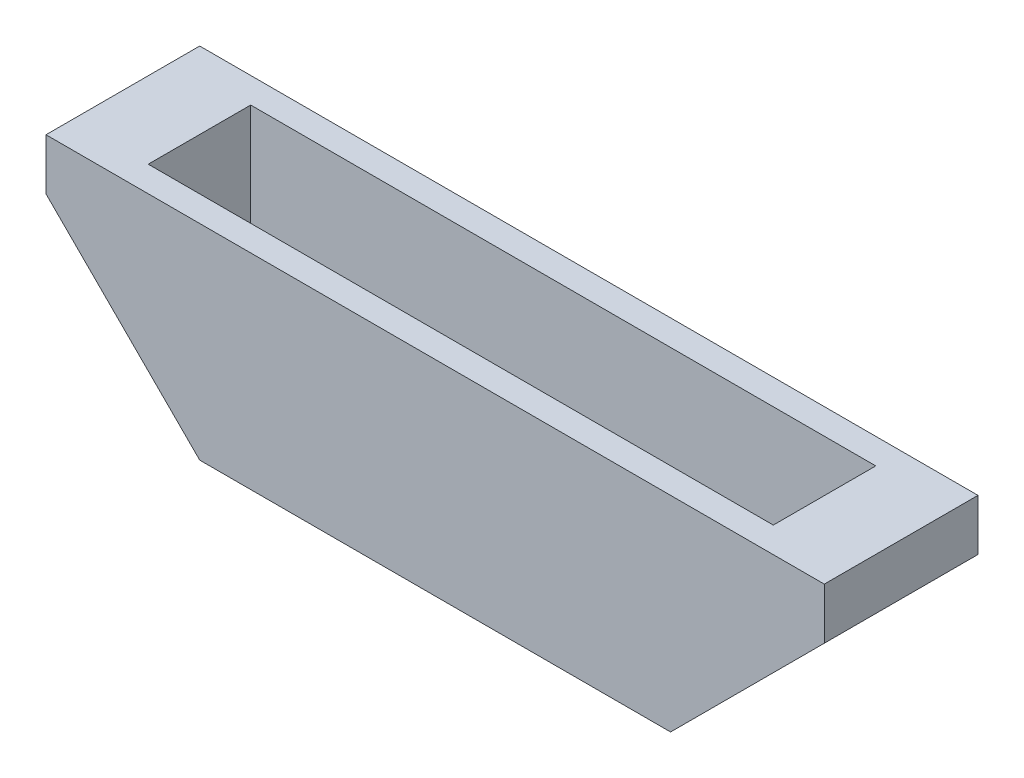
ISO-10303-21;
HEADER;
FILE_DESCRIPTION(('STEP AP214'),'2;1');
FILE_NAME('part.step','',(''),(''),'','','');
FILE_SCHEMA(('AUTOMOTIVE_DESIGN { 1 0 10303 214 1 1 1 1 }'));
ENDSEC;
DATA;
#1=APPLICATION_CONTEXT('core data for automotive mechanical design processes');
#2=APPLICATION_PROTOCOL_DEFINITION('international standard','automotive_design',2000,#1);
#3=PRODUCT_CONTEXT('',#1,'mechanical');
#4=PRODUCT('Part','Part','',(#3));
#5=PRODUCT_RELATED_PRODUCT_CATEGORY('part','',(#4));
#6=PRODUCT_DEFINITION_FORMATION('','',#4);
#7=PRODUCT_DEFINITION_CONTEXT('part definition',#1,'design');
#8=PRODUCT_DEFINITION('design','',#6,#7);
#9=PRODUCT_DEFINITION_SHAPE('','',#8);
#10=(LENGTH_UNIT() NAMED_UNIT(*) SI_UNIT(.MILLI.,.METRE.));
#11=(NAMED_UNIT(*) PLANE_ANGLE_UNIT() SI_UNIT($,.RADIAN.));
#12=(NAMED_UNIT(*) SI_UNIT($,.STERADIAN.) SOLID_ANGLE_UNIT());
#13=UNCERTAINTY_MEASURE_WITH_UNIT(LENGTH_MEASURE(1.E-05),#10,'distance_accuracy_value','');
#14=(GEOMETRIC_REPRESENTATION_CONTEXT(3) GLOBAL_UNCERTAINTY_ASSIGNED_CONTEXT((#13)) GLOBAL_UNIT_ASSIGNED_CONTEXT((#10,
#11,#12)) REPRESENTATION_CONTEXT('',''));
#15=CARTESIAN_POINT('',(0.,0.,0.));
#16=DIRECTION('',(0.,0.,1.));
#17=DIRECTION('',(1.,0.,0.));
#18=AXIS2_PLACEMENT_3D('',#15,#16,#17);
#19=CARTESIAN_POINT('',(0.,0.,0.));
#20=DIRECTION('',(0.,1.,0.));
#21=DIRECTION('',(0.,0.,1.));
#22=AXIS2_PLACEMENT_3D('',#19,#20,#21);
#23=PLANE('',#22);
#24=DIRECTION('',(1.,0.,0.));
#25=VECTOR('',#24,1.);
#26=CARTESIAN_POINT('',(0.,0.,12.7));
#27=LINE('',#26,#25);
#28=CARTESIAN_POINT('',(-77.47,0.,12.7));
#29=VERTEX_POINT('',#28);
#30=CARTESIAN_POINT('',(77.47,0.,12.7));
#31=VERTEX_POINT('',#30);
#32=EDGE_CURVE('E84',#29,#31,#27,.T.);
#33=ORIENTED_EDGE('',*,*,#32,.F.);
#34=DIRECTION('',(0.,0.,-1.));
#35=VECTOR('',#34,1.);
#36=CARTESIAN_POINT('',(-77.47,0.,0.));
#37=LINE('',#36,#35);
#38=CARTESIAN_POINT('',(-77.47,0.,-12.7));
#39=VERTEX_POINT('',#38);
#40=EDGE_CURVE('E182',#29,#39,#37,.T.);
#41=ORIENTED_EDGE('',*,*,#40,.T.);
#42=DIRECTION('',(1.,0.,0.));
#43=VECTOR('',#42,1.);
#44=CARTESIAN_POINT('',(0.,0.,-12.7));
#45=LINE('',#44,#43);
#46=CARTESIAN_POINT('',(77.47,0.,-12.7));
#47=VERTEX_POINT('',#46);
#48=EDGE_CURVE('E163',#39,#47,#45,.T.);
#49=ORIENTED_EDGE('',*,*,#48,.T.);
#50=DIRECTION('',(0.,0.,-1.));
#51=VECTOR('',#50,1.);
#52=CARTESIAN_POINT('',(77.47,0.,0.));
#53=LINE('',#52,#51);
#54=EDGE_CURVE('E175',#31,#47,#53,.T.);
#55=ORIENTED_EDGE('',*,*,#54,.F.);
#56=EDGE_LOOP('',(#33,#41,#49,#55));
#57=FACE_BOUND('',#56,.T.);
#58=DIRECTION('',(1.,0.,0.));
#59=VECTOR('',#58,1.);
#60=CARTESIAN_POINT('',(0.,0.,19.05));
#61=LINE('',#60,#59);
#62=CARTESIAN_POINT('',(-96.460563282851,0.,19.05));
#63=VERTEX_POINT('',#62);
#64=CARTESIAN_POINT('',(96.4605632828511,0.,19.05));
#65=VERTEX_POINT('',#64);
#66=EDGE_CURVE('E206',#63,#65,#61,.T.);
#67=ORIENTED_EDGE('',*,*,#66,.T.);
#68=DIRECTION('',(0.,0.,-1.));
#69=VECTOR('',#68,1.);
#70=CARTESIAN_POINT('',(96.4605632828511,0.,0.));
#71=LINE('',#70,#69);
#72=CARTESIAN_POINT('',(96.4605632828511,0.,-19.05));
#73=VERTEX_POINT('',#72);
#74=EDGE_CURVE('E220',#65,#73,#71,.T.);
#75=ORIENTED_EDGE('',*,*,#74,.T.);
#76=DIRECTION('',(1.,0.,0.));
#77=VECTOR('',#76,1.);
#78=CARTESIAN_POINT('',(0.,0.,-19.05));
#79=LINE('',#78,#77);
#80=CARTESIAN_POINT('',(-96.460563282851,0.,-19.05));
#81=VERTEX_POINT('',#80);
#82=EDGE_CURVE('E224',#81,#73,#79,.T.);
#83=ORIENTED_EDGE('',*,*,#82,.F.);
#84=DIRECTION('',(0.,0.,-1.));
#85=VECTOR('',#84,1.);
#86=CARTESIAN_POINT('',(-96.460563282851,0.,0.));
#87=LINE('',#86,#85);
#88=EDGE_CURVE('E212',#63,#81,#87,.T.);
#89=ORIENTED_EDGE('',*,*,#88,.F.);
#90=EDGE_LOOP('',(#67,#75,#83,#89));
#91=FACE_BOUND('',#90,.T.);
#92=ADVANCED_FACE('F67',(#57,#91),#23,.T.);
#93=CARTESIAN_POINT('',(-96.460563282851,-50.8,0.));
#94=DIRECTION('',(1.,0.,0.));
#95=DIRECTION('',(0.,0.,-1.));
#96=AXIS2_PLACEMENT_3D('',#93,#94,#95);
#97=PLANE('',#96);
#98=DIRECTION('',(0.,1.,0.));
#99=VECTOR('',#98,1.);
#100=CARTESIAN_POINT('',(-96.460563282851,-50.8,-19.05));
#101=LINE('',#100,#99);
#102=CARTESIAN_POINT('',(-96.460563282851,-12.6999999999998,-19.05));
#103=VERTEX_POINT('',#102);
#104=EDGE_CURVE('E235',#103,#81,#101,.T.);
#105=ORIENTED_EDGE('',*,*,#104,.F.);
#106=DIRECTION('',(0.,0.,1.));
#107=VECTOR('',#106,1.);
#108=CARTESIAN_POINT('',(-96.460563282851,-12.6999999999998,0.));
#109=LINE('',#108,#107);
#110=CARTESIAN_POINT('',(-96.460563282851,-12.6999999999998,19.05));
#111=VERTEX_POINT('',#110);
#112=EDGE_CURVE('E265',#103,#111,#109,.T.);
#113=ORIENTED_EDGE('',*,*,#112,.T.);
#114=DIRECTION('',(0.,1.,0.));
#115=VECTOR('',#114,1.);
#116=CARTESIAN_POINT('',(-96.460563282851,-50.8,19.05));
#117=LINE('',#116,#115);
#118=EDGE_CURVE('E231',#111,#63,#117,.T.);
#119=ORIENTED_EDGE('',*,*,#118,.T.);
#120=ORIENTED_EDGE('',*,*,#88,.T.);
#121=EDGE_LOOP('',(#105,#113,#119,#120));
#122=FACE_BOUND('',#121,.T.);
#123=ADVANCED_FACE('F302',(#122),#97,.F.);
#124=CARTESIAN_POINT('',(0.,-50.8,19.05));
#125=DIRECTION('',(0.,0.,1.));
#126=DIRECTION('',(1.,0.,0.));
#127=AXIS2_PLACEMENT_3D('',#124,#125,#126);
#128=PLANE('',#127);
#129=DIRECTION('',(1.,0.,0.));
#130=VECTOR('',#129,1.);
#131=CARTESIAN_POINT('',(0.,-50.8,19.05));
#132=LINE('',#131,#130);
#133=CARTESIAN_POINT('',(-58.360563282851,-50.8,19.05));
#134=VERTEX_POINT('',#133);
#135=CARTESIAN_POINT('',(58.3605632828509,-50.8,19.05));
#136=VERTEX_POINT('',#135);
#137=EDGE_CURVE('E207',#134,#136,#132,.T.);
#138=ORIENTED_EDGE('',*,*,#137,.T.);
#139=DIRECTION('',(0.707106781186549,0.707106781186547,0.));
#140=VECTOR('',#139,1.);
#141=CARTESIAN_POINT('',(29.1802816414254,-79.9802816414255,19.05));
#142=LINE('',#141,#140);
#143=CARTESIAN_POINT('',(96.4605632828511,-12.7,19.05));
#144=VERTEX_POINT('',#143);
#145=EDGE_CURVE('E262',#136,#144,#142,.T.);
#146=ORIENTED_EDGE('',*,*,#145,.T.);
#147=DIRECTION('',(0.,1.,0.));
#148=VECTOR('',#147,1.);
#149=CARTESIAN_POINT('',(96.4605632828511,-50.8,19.05));
#150=LINE('',#149,#148);
#151=EDGE_CURVE('E216',#144,#65,#150,.T.);
#152=ORIENTED_EDGE('',*,*,#151,.T.);
#153=ORIENTED_EDGE('',*,*,#66,.F.);
#154=ORIENTED_EDGE('',*,*,#118,.F.);
#155=DIRECTION('',(-0.707106781186546,0.707106781186549,0.));
#156=VECTOR('',#155,1.);
#157=CARTESIAN_POINT('',(-29.1802816414256,-79.9802816414255,19.05));
#158=LINE('',#157,#156);
#159=EDGE_CURVE('E259',#111,#134,#158,.F.);
#160=ORIENTED_EDGE('',*,*,#159,.T.);
#161=EDGE_LOOP('',(#138,#146,#152,#153,#154,#160));
#162=FACE_BOUND('',#161,.T.);
#163=ADVANCED_FACE('F304',(#162),#128,.T.);
#164=CARTESIAN_POINT('',(96.4605632828511,-50.8,0.));
#165=DIRECTION('',(1.,0.,0.));
#166=DIRECTION('',(0.,0.,-1.));
#167=AXIS2_PLACEMENT_3D('',#164,#165,#166);
#168=PLANE('',#167);
#169=ORIENTED_EDGE('',*,*,#151,.F.);
#170=DIRECTION('',(0.,0.,-1.));
#171=VECTOR('',#170,1.);
#172=CARTESIAN_POINT('',(96.4605632828511,-12.7,-19.05));
#173=LINE('',#172,#171);
#174=CARTESIAN_POINT('',(96.4605632828511,-12.7,-19.05));
#175=VERTEX_POINT('',#174);
#176=EDGE_CURVE('E234',#144,#175,#173,.T.);
#177=ORIENTED_EDGE('',*,*,#176,.T.);
#178=DIRECTION('',(0.,1.,0.));
#179=VECTOR('',#178,1.);
#180=CARTESIAN_POINT('',(96.4605632828511,-50.8,-19.05));
#181=LINE('',#180,#179);
#182=EDGE_CURVE('E238',#175,#73,#181,.T.);
#183=ORIENTED_EDGE('',*,*,#182,.T.);
#184=ORIENTED_EDGE('',*,*,#74,.F.);
#185=EDGE_LOOP('',(#169,#177,#183,#184));
#186=FACE_BOUND('',#185,.T.);
#187=ADVANCED_FACE('F311',(#186),#168,.T.);
#188=CARTESIAN_POINT('',(0.,-50.8,-19.05));
#189=DIRECTION('',(0.,0.,1.));
#190=DIRECTION('',(1.,0.,0.));
#191=AXIS2_PLACEMENT_3D('',#188,#189,#190);
#192=PLANE('',#191);
#193=ORIENTED_EDGE('',*,*,#182,.F.);
#194=DIRECTION('',(-0.707106781186549,-0.707106781186547,0.));
#195=VECTOR('',#194,1.);
#196=CARTESIAN_POINT('',(96.4605632828511,-12.7,-19.05));
#197=LINE('',#196,#195);
#198=CARTESIAN_POINT('',(58.3605632828509,-50.8,-19.05));
#199=VERTEX_POINT('',#198);
#200=EDGE_CURVE('E249',#175,#199,#197,.T.);
#201=ORIENTED_EDGE('',*,*,#200,.T.);
#202=DIRECTION('',(1.,0.,0.));
#203=VECTOR('',#202,1.);
#204=CARTESIAN_POINT('',(0.,-50.8,-19.05));
#205=LINE('',#204,#203);
#206=CARTESIAN_POINT('',(-58.360563282851,-50.8,-19.05));
#207=VERTEX_POINT('',#206);
#208=EDGE_CURVE('E211',#207,#199,#205,.T.);
#209=ORIENTED_EDGE('',*,*,#208,.F.);
#210=DIRECTION('',(0.707106781186546,-0.707106781186549,0.));
#211=VECTOR('',#210,1.);
#212=CARTESIAN_POINT('',(-58.360563282851,-50.8,-19.05));
#213=LINE('',#212,#211);
#214=EDGE_CURVE('E246',#207,#103,#213,.F.);
#215=ORIENTED_EDGE('',*,*,#214,.T.);
#216=ORIENTED_EDGE('',*,*,#104,.T.);
#217=ORIENTED_EDGE('',*,*,#82,.T.);
#218=EDGE_LOOP('',(#193,#201,#209,#215,#216,#217));
#219=FACE_BOUND('',#218,.T.);
#220=ADVANCED_FACE('F318',(#219),#192,.F.);
#221=CARTESIAN_POINT('',(0.,-50.8,0.));
#222=DIRECTION('',(0.,1.,0.));
#223=DIRECTION('',(0.,0.,1.));
#224=AXIS2_PLACEMENT_3D('',#221,#222,#223);
#225=PLANE('',#224);
#226=ORIENTED_EDGE('',*,*,#208,.T.);
#227=DIRECTION('',(0.,0.,1.));
#228=VECTOR('',#227,1.);
#229=CARTESIAN_POINT('',(58.3605632828509,-50.8,19.05));
#230=LINE('',#229,#228);
#231=EDGE_CURVE('E256',#199,#136,#230,.T.);
#232=ORIENTED_EDGE('',*,*,#231,.T.);
#233=ORIENTED_EDGE('',*,*,#137,.F.);
#234=DIRECTION('',(0.,0.,-1.));
#235=VECTOR('',#234,1.);
#236=CARTESIAN_POINT('',(-58.360563282851,-50.8,0.));
#237=LINE('',#236,#235);
#238=EDGE_CURVE('E252',#134,#207,#237,.T.);
#239=ORIENTED_EDGE('',*,*,#238,.T.);
#240=EDGE_LOOP('',(#226,#232,#233,#239));
#241=FACE_BOUND('',#240,.T.);
#242=ADVANCED_FACE('F321',(#241),#225,.F.);
#243=CARTESIAN_POINT('',(96.4605632828511,-12.7,0.));
#244=DIRECTION('',(0.707106781186547,-0.707106781186549,0.));
#245=DIRECTION('',(0.,0.,1.));
#246=AXIS2_PLACEMENT_3D('',#243,#244,#245);
#247=PLANE('',#246);
#248=DIRECTION('',(0.,0.,1.));
#249=VECTOR('',#248,1.);
#250=CARTESIAN_POINT('',(77.47,-31.690563282851,0.));
#251=LINE('',#250,#249);
#252=CARTESIAN_POINT('',(77.47,-31.690563282851,-12.7));
#253=VERTEX_POINT('',#252);
#254=CARTESIAN_POINT('',(77.47,-31.690563282851,12.7));
#255=VERTEX_POINT('',#254);
#256=EDGE_CURVE('E12',#253,#255,#251,.T.);
#257=ORIENTED_EDGE('',*,*,#256,.F.);
#258=DIRECTION('',(-0.707106781186549,-0.707106781186547,0.));
#259=VECTOR('',#258,1.);
#260=CARTESIAN_POINT('',(96.4605632828511,-12.7,-12.7));
#261=LINE('',#260,#259);
#262=CARTESIAN_POINT('',(73.600563282851,-35.56,-12.7));
#263=VERTEX_POINT('',#262);
#264=EDGE_CURVE('E167',#253,#263,#261,.T.);
#265=ORIENTED_EDGE('',*,*,#264,.T.);
#266=DIRECTION('',(0.,0.,1.));
#267=VECTOR('',#266,1.);
#268=CARTESIAN_POINT('',(73.600563282851,-35.56,0.));
#269=LINE('',#268,#267);
#270=CARTESIAN_POINT('',(73.600563282851,-35.56,12.7));
#271=VERTEX_POINT('',#270);
#272=EDGE_CURVE('E192',#263,#271,#269,.T.);
#273=ORIENTED_EDGE('',*,*,#272,.T.);
#274=DIRECTION('',(-0.707106781186549,-0.707106781186547,0.));
#275=VECTOR('',#274,1.);
#276=CARTESIAN_POINT('',(96.4605632828511,-12.7,12.7));
#277=LINE('',#276,#275);
#278=EDGE_CURVE('E203',#255,#271,#277,.T.);
#279=ORIENTED_EDGE('',*,*,#278,.F.);
#280=EDGE_LOOP('',(#257,#265,#273,#279));
#281=FACE_BOUND('',#280,.T.);
#282=ORIENTED_EDGE('',*,*,#145,.F.);
#283=ORIENTED_EDGE('',*,*,#231,.F.);
#284=ORIENTED_EDGE('',*,*,#200,.F.);
#285=ORIENTED_EDGE('',*,*,#176,.F.);
#286=EDGE_LOOP('',(#282,#283,#284,#285));
#287=FACE_BOUND('',#286,.T.);
#288=ADVANCED_FACE('F291',(#281,#287),#247,.T.);
#289=CARTESIAN_POINT('',(-58.360563282851,-50.8,0.));
#290=DIRECTION('',(0.707106781186549,0.707106781186546,0.));
#291=DIRECTION('',(0.,0.,-1.));
#292=AXIS2_PLACEMENT_3D('',#289,#290,#291);
#293=PLANE('',#292);
#294=DIRECTION('',(0.707106781186546,-0.707106781186549,0.));
#295=VECTOR('',#294,1.);
#296=CARTESIAN_POINT('',(-58.360563282851,-50.8,12.7));
#297=LINE('',#296,#295);
#298=CARTESIAN_POINT('',(-73.6005632828509,-35.56,12.7));
#299=VERTEX_POINT('',#298);
#300=CARTESIAN_POINT('',(-77.47,-31.6905632828509,12.7));
#301=VERTEX_POINT('',#300);
#302=EDGE_CURVE('E77',#299,#301,#297,.F.);
#303=ORIENTED_EDGE('',*,*,#302,.F.);
#304=DIRECTION('',(0.,0.,1.));
#305=VECTOR('',#304,1.);
#306=CARTESIAN_POINT('',(-73.6005632828509,-35.56,0.));
#307=LINE('',#306,#305);
#308=CARTESIAN_POINT('',(-73.6005632828509,-35.56,-12.7));
#309=VERTEX_POINT('',#308);
#310=EDGE_CURVE('E268',#299,#309,#307,.F.);
#311=ORIENTED_EDGE('',*,*,#310,.T.);
#312=DIRECTION('',(0.707106781186546,-0.707106781186549,0.));
#313=VECTOR('',#312,1.);
#314=CARTESIAN_POINT('',(-58.360563282851,-50.8,-12.7));
#315=LINE('',#314,#313);
#316=CARTESIAN_POINT('',(-77.47,-31.6905632828509,-12.7));
#317=VERTEX_POINT('',#316);
#318=EDGE_CURVE('E272',#309,#317,#315,.F.);
#319=ORIENTED_EDGE('',*,*,#318,.T.);
#320=DIRECTION('',(0.,0.,-1.));
#321=VECTOR('',#320,1.);
#322=CARTESIAN_POINT('',(-77.47,-31.6905632828509,0.));
#323=LINE('',#322,#321);
#324=EDGE_CURVE('E276',#317,#301,#323,.F.);
#325=ORIENTED_EDGE('',*,*,#324,.T.);
#326=EDGE_LOOP('',(#303,#311,#319,#325));
#327=FACE_BOUND('',#326,.T.);
#328=ORIENTED_EDGE('',*,*,#159,.F.);
#329=ORIENTED_EDGE('',*,*,#112,.F.);
#330=ORIENTED_EDGE('',*,*,#214,.F.);
#331=ORIENTED_EDGE('',*,*,#238,.F.);
#332=EDGE_LOOP('',(#328,#329,#330,#331));
#333=FACE_BOUND('',#332,.T.);
#334=ADVANCED_FACE('F70',(#327,#333),#293,.F.);
#335=CARTESIAN_POINT('',(0.,-35.56,12.7));
#336=DIRECTION('',(0.,0.,1.));
#337=DIRECTION('',(1.,0.,0.));
#338=AXIS2_PLACEMENT_3D('',#335,#336,#337);
#339=PLANE('',#338);
#340=ORIENTED_EDGE('',*,*,#278,.T.);
#341=DIRECTION('',(1.,0.,0.));
#342=VECTOR('',#341,1.);
#343=CARTESIAN_POINT('',(0.,-35.56,12.7));
#344=LINE('',#343,#342);
#345=EDGE_CURVE('E92',#299,#271,#344,.T.);
#346=ORIENTED_EDGE('',*,*,#345,.F.);
#347=ORIENTED_EDGE('',*,*,#302,.T.);
#348=DIRECTION('',(0.,1.,0.));
#349=VECTOR('',#348,1.);
#350=CARTESIAN_POINT('',(-77.47,-35.56,12.7));
#351=LINE('',#350,#349);
#352=EDGE_CURVE('E189',#301,#29,#351,.T.);
#353=ORIENTED_EDGE('',*,*,#352,.T.);
#354=ORIENTED_EDGE('',*,*,#32,.T.);
#355=DIRECTION('',(0.,1.,0.));
#356=VECTOR('',#355,1.);
#357=CARTESIAN_POINT('',(77.47,-35.56,12.7));
#358=LINE('',#357,#356);
#359=EDGE_CURVE('E172',#255,#31,#358,.T.);
#360=ORIENTED_EDGE('',*,*,#359,.F.);
#361=EDGE_LOOP('',(#340,#346,#347,#353,#354,#360));
#362=FACE_BOUND('',#361,.T.);
#363=ADVANCED_FACE('F282',(#362),#339,.F.);
#364=CARTESIAN_POINT('',(-77.47,-35.56,0.));
#365=DIRECTION('',(1.,0.,0.));
#366=DIRECTION('',(0.,0.,-1.));
#367=AXIS2_PLACEMENT_3D('',#364,#365,#366);
#368=PLANE('',#367);
#369=DIRECTION('',(0.,1.,0.));
#370=VECTOR('',#369,1.);
#371=CARTESIAN_POINT('',(-77.47,-35.56,-12.7));
#372=LINE('',#371,#370);
#373=EDGE_CURVE('E171',#317,#39,#372,.T.);
#374=ORIENTED_EDGE('',*,*,#373,.T.);
#375=ORIENTED_EDGE('',*,*,#40,.F.);
#376=ORIENTED_EDGE('',*,*,#352,.F.);
#377=ORIENTED_EDGE('',*,*,#324,.F.);
#378=EDGE_LOOP('',(#374,#375,#376,#377));
#379=FACE_BOUND('',#378,.T.);
#380=ADVANCED_FACE('F285',(#379),#368,.T.);
#381=CARTESIAN_POINT('',(0.,-35.56,-12.7));
#382=DIRECTION('',(0.,0.,1.));
#383=DIRECTION('',(1.,0.,0.));
#384=AXIS2_PLACEMENT_3D('',#381,#382,#383);
#385=PLANE('',#384);
#386=DIRECTION('',(0.,1.,0.));
#387=VECTOR('',#386,1.);
#388=CARTESIAN_POINT('',(77.47,-35.56,-12.7));
#389=LINE('',#388,#387);
#390=EDGE_CURVE('E158',#253,#47,#389,.T.);
#391=ORIENTED_EDGE('',*,*,#390,.T.);
#392=ORIENTED_EDGE('',*,*,#48,.F.);
#393=ORIENTED_EDGE('',*,*,#373,.F.);
#394=ORIENTED_EDGE('',*,*,#318,.F.);
#395=DIRECTION('',(1.,0.,0.));
#396=VECTOR('',#395,1.);
#397=CARTESIAN_POINT('',(0.,-35.56,-12.7));
#398=LINE('',#397,#396);
#399=EDGE_CURVE('E197',#309,#263,#398,.T.);
#400=ORIENTED_EDGE('',*,*,#399,.T.);
#401=ORIENTED_EDGE('',*,*,#264,.F.);
#402=EDGE_LOOP('',(#391,#392,#393,#394,#400,#401));
#403=FACE_BOUND('',#402,.T.);
#404=ADVANCED_FACE('F160',(#403),#385,.T.);
#405=CARTESIAN_POINT('',(77.47,-35.56,0.));
#406=DIRECTION('',(1.,0.,0.));
#407=DIRECTION('',(0.,0.,-1.));
#408=AXIS2_PLACEMENT_3D('',#405,#406,#407);
#409=PLANE('',#408);
#410=ORIENTED_EDGE('',*,*,#256,.T.);
#411=ORIENTED_EDGE('',*,*,#359,.T.);
#412=ORIENTED_EDGE('',*,*,#54,.T.);
#413=ORIENTED_EDGE('',*,*,#390,.F.);
#414=EDGE_LOOP('',(#410,#411,#412,#413));
#415=FACE_BOUND('',#414,.T.);
#416=ADVANCED_FACE('F176',(#415),#409,.F.);
#417=CARTESIAN_POINT('',(0.,-35.56,0.));
#418=DIRECTION('',(0.,1.,0.));
#419=DIRECTION('',(0.,0.,1.));
#420=AXIS2_PLACEMENT_3D('',#417,#418,#419);
#421=PLANE('',#420);
#422=ORIENTED_EDGE('',*,*,#399,.F.);
#423=ORIENTED_EDGE('',*,*,#310,.F.);
#424=ORIENTED_EDGE('',*,*,#345,.T.);
#425=ORIENTED_EDGE('',*,*,#272,.F.);
#426=EDGE_LOOP('',(#422,#423,#424,#425));
#427=FACE_BOUND('',#426,.T.);
#428=ADVANCED_FACE('F294',(#427),#421,.T.);
#429=CLOSED_SHELL('',(#92,#123,#163,#187,#220,#242,#288,#334,#363,#380,#404,#416,#428));
#430=MANIFOLD_SOLID_BREP('B2',#429);
#431=ADVANCED_BREP_SHAPE_REPRESENTATION('',(#18,#430),#14);
#432=SHAPE_DEFINITION_REPRESENTATION(#9,#431);
ENDSEC;
END-ISO-10303-21;
